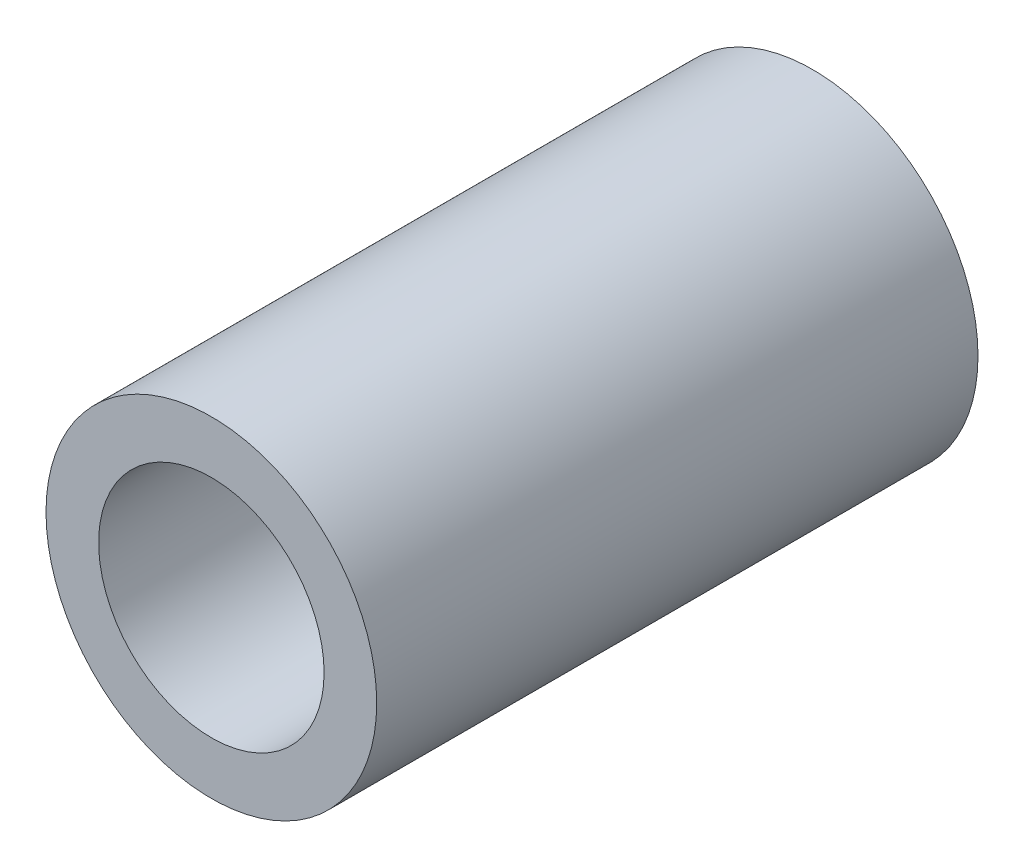
ISO-10303-21;
HEADER;
FILE_DESCRIPTION(('STEP AP214'),'2;1');
FILE_NAME('part.step','',(''),(''),'','','');
FILE_SCHEMA(('AUTOMOTIVE_DESIGN { 1 0 10303 214 1 1 1 1 }'));
ENDSEC;
DATA;
#1=APPLICATION_CONTEXT('core data for automotive mechanical design processes');
#2=APPLICATION_PROTOCOL_DEFINITION('international standard','automotive_design',2000,#1);
#3=PRODUCT_CONTEXT('',#1,'mechanical');
#4=PRODUCT('Part','Part','',(#3));
#5=PRODUCT_RELATED_PRODUCT_CATEGORY('part','',(#4));
#6=PRODUCT_DEFINITION_FORMATION('','',#4);
#7=PRODUCT_DEFINITION_CONTEXT('part definition',#1,'design');
#8=PRODUCT_DEFINITION('design','',#6,#7);
#9=PRODUCT_DEFINITION_SHAPE('','',#8);
#10=(LENGTH_UNIT() NAMED_UNIT(*) SI_UNIT(.MILLI.,.METRE.));
#11=(NAMED_UNIT(*) PLANE_ANGLE_UNIT() SI_UNIT($,.RADIAN.));
#12=(NAMED_UNIT(*) SI_UNIT($,.STERADIAN.) SOLID_ANGLE_UNIT());
#13=UNCERTAINTY_MEASURE_WITH_UNIT(LENGTH_MEASURE(1.E-05),#10,'distance_accuracy_value','');
#14=(GEOMETRIC_REPRESENTATION_CONTEXT(3) GLOBAL_UNCERTAINTY_ASSIGNED_CONTEXT((#13)) GLOBAL_UNIT_ASSIGNED_CONTEXT((#10,
#11,#12)) REPRESENTATION_CONTEXT('',''));
#15=CARTESIAN_POINT('',(0.,0.,0.));
#16=DIRECTION('',(0.,0.,1.));
#17=DIRECTION('',(1.,0.,0.));
#18=AXIS2_PLACEMENT_3D('',#15,#16,#17);
#19=CARTESIAN_POINT('',(0.,0.,8.));
#20=DIRECTION('',(0.,0.,1.));
#21=DIRECTION('',(1.,0.,0.));
#22=AXIS2_PLACEMENT_3D('',#19,#20,#21);
#23=PLANE('',#22);
#24=CARTESIAN_POINT('',(0.,0.,8.));
#25=DIRECTION('',(0.,0.,1.));
#26=DIRECTION('',(1.,0.,0.));
#27=AXIS2_PLACEMENT_3D('',#24,#25,#26);
#28=CIRCLE('',#27,2.2);
#29=CARTESIAN_POINT('',(2.2,0.,8.));
#30=VERTEX_POINT('',#29);
#31=EDGE_CURVE('E10',#30,#30,#28,.T.);
#32=ORIENTED_EDGE('',*,*,#31,.T.);
#33=EDGE_LOOP('',(#32));
#34=FACE_BOUND('',#33,.T.);
#35=CARTESIAN_POINT('',(0.,0.,8.));
#36=DIRECTION('',(0.,0.,1.));
#37=DIRECTION('',(1.,0.,0.));
#38=AXIS2_PLACEMENT_3D('',#35,#36,#37);
#39=CIRCLE('',#38,1.5);
#40=CARTESIAN_POINT('',(1.5,0.,8.));
#41=VERTEX_POINT('',#40);
#42=EDGE_CURVE('E44',#41,#41,#39,.T.);
#43=ORIENTED_EDGE('',*,*,#42,.F.);
#44=EDGE_LOOP('',(#43));
#45=FACE_BOUND('',#44,.T.);
#46=ADVANCED_FACE('F33',(#34,#45),#23,.T.);
#47=CARTESIAN_POINT('',(0.,0.,0.));
#48=DIRECTION('',(0.,0.,1.));
#49=DIRECTION('',(1.,0.,0.));
#50=AXIS2_PLACEMENT_3D('',#47,#48,#49);
#51=PLANE('',#50);
#52=CARTESIAN_POINT('',(0.,0.,0.));
#53=DIRECTION('',(0.,0.,1.));
#54=DIRECTION('',(1.,0.,0.));
#55=AXIS2_PLACEMENT_3D('',#52,#53,#54);
#56=CIRCLE('',#55,2.2);
#57=CARTESIAN_POINT('',(2.2,0.,0.));
#58=VERTEX_POINT('',#57);
#59=EDGE_CURVE('E37',#58,#58,#56,.T.);
#60=ORIENTED_EDGE('',*,*,#59,.F.);
#61=EDGE_LOOP('',(#60));
#62=FACE_BOUND('',#61,.T.);
#63=CARTESIAN_POINT('',(0.,0.,0.));
#64=DIRECTION('',(0.,0.,1.));
#65=DIRECTION('',(1.,0.,0.));
#66=AXIS2_PLACEMENT_3D('',#63,#64,#65);
#67=CIRCLE('',#66,1.5);
#68=CARTESIAN_POINT('',(1.5,0.,0.));
#69=VERTEX_POINT('',#68);
#70=EDGE_CURVE('E46',#69,#69,#67,.T.);
#71=ORIENTED_EDGE('',*,*,#70,.T.);
#72=EDGE_LOOP('',(#71));
#73=FACE_BOUND('',#72,.T.);
#74=ADVANCED_FACE('F56',(#62,#73),#51,.F.);
#75=CARTESIAN_POINT('',(0.,0.,8.));
#76=DIRECTION('',(0.,0.,-1.));
#77=DIRECTION('',(-1.,0.,0.));
#78=AXIS2_PLACEMENT_3D('',#75,#76,#77);
#79=CYLINDRICAL_SURFACE('',#78,2.2);
#80=ORIENTED_EDGE('',*,*,#31,.F.);
#81=EDGE_LOOP('',(#80));
#82=FACE_BOUND('',#81,.T.);
#83=ORIENTED_EDGE('',*,*,#59,.T.);
#84=EDGE_LOOP('',(#83));
#85=FACE_BOUND('',#84,.T.);
#86=ADVANCED_FACE('F35',(#82,#85),#79,.T.);
#87=CARTESIAN_POINT('',(0.,0.,8.));
#88=DIRECTION('',(0.,0.,-1.));
#89=DIRECTION('',(-1.,0.,0.));
#90=AXIS2_PLACEMENT_3D('',#87,#88,#89);
#91=CYLINDRICAL_SURFACE('',#90,1.5);
#92=ORIENTED_EDGE('',*,*,#42,.T.);
#93=EDGE_LOOP('',(#92));
#94=FACE_BOUND('',#93,.T.);
#95=ORIENTED_EDGE('',*,*,#70,.F.);
#96=EDGE_LOOP('',(#95));
#97=FACE_BOUND('',#96,.T.);
#98=ADVANCED_FACE('F52',(#94,#97),#91,.F.);
#99=CLOSED_SHELL('',(#46,#74,#86,#98));
#100=MANIFOLD_SOLID_BREP('B2',#99);
#101=ADVANCED_BREP_SHAPE_REPRESENTATION('',(#18,#100),#14);
#102=SHAPE_DEFINITION_REPRESENTATION(#9,#101);
ENDSEC;
END-ISO-10303-21;
